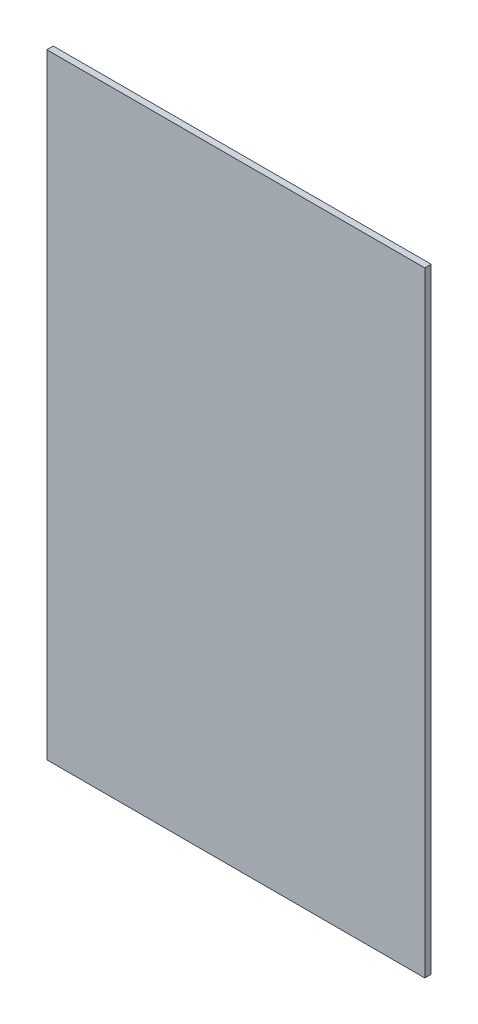
ISO-10303-21;
HEADER;
FILE_DESCRIPTION(('STEP AP214'),'2;1');
FILE_NAME('part.step','',(''),(''),'','','');
FILE_SCHEMA(('AUTOMOTIVE_DESIGN { 1 0 10303 214 1 1 1 1 }'));
ENDSEC;
DATA;
#1=APPLICATION_CONTEXT('core data for automotive mechanical design processes');
#2=APPLICATION_PROTOCOL_DEFINITION('international standard','automotive_design',2000,#1);
#3=PRODUCT_CONTEXT('',#1,'mechanical');
#4=PRODUCT('Part','Part','',(#3));
#5=PRODUCT_RELATED_PRODUCT_CATEGORY('part','',(#4));
#6=PRODUCT_DEFINITION_FORMATION('','',#4);
#7=PRODUCT_DEFINITION_CONTEXT('part definition',#1,'design');
#8=PRODUCT_DEFINITION('design','',#6,#7);
#9=PRODUCT_DEFINITION_SHAPE('','',#8);
#10=(LENGTH_UNIT() NAMED_UNIT(*) SI_UNIT(.MILLI.,.METRE.));
#11=(NAMED_UNIT(*) PLANE_ANGLE_UNIT() SI_UNIT($,.RADIAN.));
#12=(NAMED_UNIT(*) SI_UNIT($,.STERADIAN.) SOLID_ANGLE_UNIT());
#13=UNCERTAINTY_MEASURE_WITH_UNIT(LENGTH_MEASURE(1.E-05),#10,'distance_accuracy_value','');
#14=(GEOMETRIC_REPRESENTATION_CONTEXT(3) GLOBAL_UNCERTAINTY_ASSIGNED_CONTEXT((#13)) GLOBAL_UNIT_ASSIGNED_CONTEXT((#10,
#11,#12)) REPRESENTATION_CONTEXT('',''));
#15=CARTESIAN_POINT('',(0.,0.,0.));
#16=DIRECTION('',(0.,0.,1.));
#17=DIRECTION('',(1.,0.,0.));
#18=AXIS2_PLACEMENT_3D('',#15,#16,#17);
#19=CARTESIAN_POINT('',(93.6625,-152.4,3.175));
#20=DIRECTION('',(-1.,0.,0.));
#21=DIRECTION('',(0.,0.,1.));
#22=AXIS2_PLACEMENT_3D('',#19,#20,#21);
#23=PLANE('',#22);
#24=DIRECTION('',(0.,1.,0.));
#25=VECTOR('',#24,1.);
#26=CARTESIAN_POINT('',(93.6625,-152.4,0.));
#27=LINE('',#26,#25);
#28=CARTESIAN_POINT('',(93.6625,-152.4,0.));
#29=VERTEX_POINT('',#28);
#30=CARTESIAN_POINT('',(93.6625,152.4,0.));
#31=VERTEX_POINT('',#30);
#32=EDGE_CURVE('E108',#29,#31,#27,.T.);
#33=ORIENTED_EDGE('',*,*,#32,.T.);
#34=DIRECTION('',(0.,0.,-1.));
#35=VECTOR('',#34,1.);
#36=CARTESIAN_POINT('',(93.6625,152.4,3.175));
#37=LINE('',#36,#35);
#38=CARTESIAN_POINT('',(93.6625,152.4,3.175));
#39=VERTEX_POINT('',#38);
#40=EDGE_CURVE('E11',#39,#31,#37,.T.);
#41=ORIENTED_EDGE('',*,*,#40,.F.);
#42=DIRECTION('',(0.,1.,0.));
#43=VECTOR('',#42,1.);
#44=CARTESIAN_POINT('',(93.6625,-152.4,3.175));
#45=LINE('',#44,#43);
#46=CARTESIAN_POINT('',(93.6625,-152.4,3.175));
#47=VERTEX_POINT('',#46);
#48=EDGE_CURVE('E96',#47,#39,#45,.T.);
#49=ORIENTED_EDGE('',*,*,#48,.F.);
#50=DIRECTION('',(0.,0.,-1.));
#51=VECTOR('',#50,1.);
#52=CARTESIAN_POINT('',(93.6625,-152.4,3.175));
#53=LINE('',#52,#51);
#54=EDGE_CURVE('E104',#47,#29,#53,.T.);
#55=ORIENTED_EDGE('',*,*,#54,.T.);
#56=EDGE_LOOP('',(#33,#41,#49,#55));
#57=FACE_BOUND('',#56,.T.);
#58=ADVANCED_FACE('F45',(#57),#23,.F.);
#59=CARTESIAN_POINT('',(-93.6625,152.4,3.175));
#60=DIRECTION('',(0.,-1.,0.));
#61=DIRECTION('',(0.,0.,-1.));
#62=AXIS2_PLACEMENT_3D('',#59,#60,#61);
#63=PLANE('',#62);
#64=DIRECTION('',(-1.,0.,0.));
#65=VECTOR('',#64,1.);
#66=CARTESIAN_POINT('',(-93.6625,152.4,0.));
#67=LINE('',#66,#65);
#68=CARTESIAN_POINT('',(-93.6625,152.4,0.));
#69=VERTEX_POINT('',#68);
#70=EDGE_CURVE('E100',#31,#69,#67,.T.);
#71=ORIENTED_EDGE('',*,*,#70,.T.);
#72=DIRECTION('',(0.,0.,-1.));
#73=VECTOR('',#72,1.);
#74=CARTESIAN_POINT('',(-93.6625,152.4,3.175));
#75=LINE('',#74,#73);
#76=CARTESIAN_POINT('',(-93.6625,152.4,3.175));
#77=VERTEX_POINT('',#76);
#78=EDGE_CURVE('E53',#77,#69,#75,.T.);
#79=ORIENTED_EDGE('',*,*,#78,.F.);
#80=DIRECTION('',(-1.,0.,0.));
#81=VECTOR('',#80,1.);
#82=CARTESIAN_POINT('',(-93.6625,152.4,3.175));
#83=LINE('',#82,#81);
#84=EDGE_CURVE('E91',#39,#77,#83,.T.);
#85=ORIENTED_EDGE('',*,*,#84,.F.);
#86=ORIENTED_EDGE('',*,*,#40,.T.);
#87=EDGE_LOOP('',(#71,#79,#85,#86));
#88=FACE_BOUND('',#87,.T.);
#89=ADVANCED_FACE('F99',(#88),#63,.F.);
#90=CARTESIAN_POINT('',(-93.6625,-152.4,3.175));
#91=DIRECTION('',(1.,0.,0.));
#92=DIRECTION('',(0.,0.,-1.));
#93=AXIS2_PLACEMENT_3D('',#90,#91,#92);
#94=PLANE('',#93);
#95=DIRECTION('',(0.,-1.,0.));
#96=VECTOR('',#95,1.);
#97=CARTESIAN_POINT('',(-93.6625,-152.4,0.));
#98=LINE('',#97,#96);
#99=CARTESIAN_POINT('',(-93.6625,-152.4,0.));
#100=VERTEX_POINT('',#99);
#101=EDGE_CURVE('E78',#69,#100,#98,.T.);
#102=ORIENTED_EDGE('',*,*,#101,.T.);
#103=DIRECTION('',(0.,0.,-1.));
#104=VECTOR('',#103,1.);
#105=CARTESIAN_POINT('',(-93.6625,-152.4,3.175));
#106=LINE('',#105,#104);
#107=CARTESIAN_POINT('',(-93.6625,-152.4,3.175));
#108=VERTEX_POINT('',#107);
#109=EDGE_CURVE('E101',#108,#100,#106,.T.);
#110=ORIENTED_EDGE('',*,*,#109,.F.);
#111=DIRECTION('',(0.,-1.,0.));
#112=VECTOR('',#111,1.);
#113=CARTESIAN_POINT('',(-93.6625,-152.4,3.175));
#114=LINE('',#113,#112);
#115=EDGE_CURVE('E94',#77,#108,#114,.T.);
#116=ORIENTED_EDGE('',*,*,#115,.F.);
#117=ORIENTED_EDGE('',*,*,#78,.T.);
#118=EDGE_LOOP('',(#102,#110,#116,#117));
#119=FACE_BOUND('',#118,.T.);
#120=ADVANCED_FACE('F102',(#119),#94,.F.);
#121=CARTESIAN_POINT('',(-93.6625,-152.4,3.175));
#122=DIRECTION('',(0.,1.,0.));
#123=DIRECTION('',(0.,0.,1.));
#124=AXIS2_PLACEMENT_3D('',#121,#122,#123);
#125=PLANE('',#124);
#126=DIRECTION('',(1.,0.,0.));
#127=VECTOR('',#126,1.);
#128=CARTESIAN_POINT('',(-93.6625,-152.4,0.));
#129=LINE('',#128,#127);
#130=EDGE_CURVE('E84',#100,#29,#129,.T.);
#131=ORIENTED_EDGE('',*,*,#130,.T.);
#132=ORIENTED_EDGE('',*,*,#54,.F.);
#133=DIRECTION('',(1.,0.,0.));
#134=VECTOR('',#133,1.);
#135=CARTESIAN_POINT('',(-93.6625,-152.4,3.175));
#136=LINE('',#135,#134);
#137=EDGE_CURVE('E61',#108,#47,#136,.T.);
#138=ORIENTED_EDGE('',*,*,#137,.F.);
#139=ORIENTED_EDGE('',*,*,#109,.T.);
#140=EDGE_LOOP('',(#131,#132,#138,#139));
#141=FACE_BOUND('',#140,.T.);
#142=ADVANCED_FACE('F115',(#141),#125,.F.);
#143=CARTESIAN_POINT('',(0.,0.,3.175));
#144=DIRECTION('',(0.,0.,-1.));
#145=DIRECTION('',(-1.,0.,0.));
#146=AXIS2_PLACEMENT_3D('',#143,#144,#145);
#147=PLANE('',#146);
#148=ORIENTED_EDGE('',*,*,#48,.T.);
#149=ORIENTED_EDGE('',*,*,#84,.T.);
#150=ORIENTED_EDGE('',*,*,#115,.T.);
#151=ORIENTED_EDGE('',*,*,#137,.T.);
#152=EDGE_LOOP('',(#148,#149,#150,#151));
#153=FACE_BOUND('',#152,.T.);
#154=ADVANCED_FACE('F92',(#153),#147,.F.);
#155=CARTESIAN_POINT('',(0.,0.,0.));
#156=DIRECTION('',(0.,0.,-1.));
#157=DIRECTION('',(-1.,0.,0.));
#158=AXIS2_PLACEMENT_3D('',#155,#156,#157);
#159=PLANE('',#158);
#160=ORIENTED_EDGE('',*,*,#32,.F.);
#161=ORIENTED_EDGE('',*,*,#130,.F.);
#162=ORIENTED_EDGE('',*,*,#101,.F.);
#163=ORIENTED_EDGE('',*,*,#70,.F.);
#164=EDGE_LOOP('',(#160,#161,#162,#163));
#165=FACE_BOUND('',#164,.T.);
#166=ADVANCED_FACE('F118',(#165),#159,.T.);
#167=CLOSED_SHELL('',(#58,#89,#120,#142,#154,#166));
#168=MANIFOLD_SOLID_BREP('B2',#167);
#169=ADVANCED_BREP_SHAPE_REPRESENTATION('',(#18,#168),#14);
#170=SHAPE_DEFINITION_REPRESENTATION(#9,#169);
ENDSEC;
END-ISO-10303-21;
